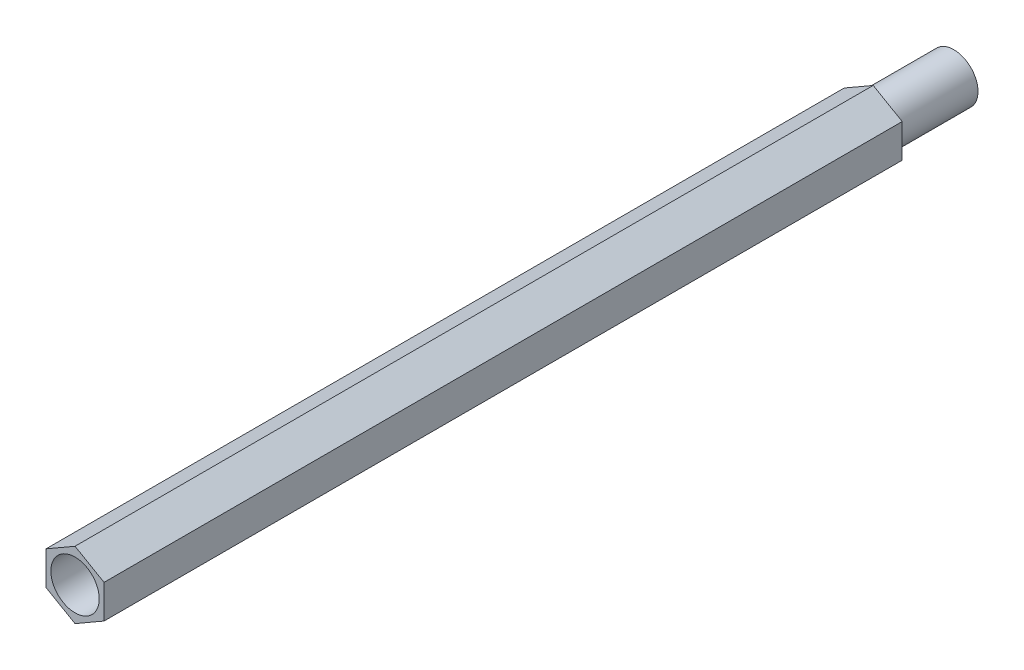
ISO-10303-21;
HEADER;
FILE_DESCRIPTION(('STEP AP214'),'2;1');
FILE_NAME('part.step','',(''),(''),'','','');
FILE_SCHEMA(('AUTOMOTIVE_DESIGN { 1 0 10303 214 1 1 1 1 }'));
ENDSEC;
DATA;
#1=APPLICATION_CONTEXT('core data for automotive mechanical design processes');
#2=APPLICATION_PROTOCOL_DEFINITION('international standard','automotive_design',2000,#1);
#3=PRODUCT_CONTEXT('',#1,'mechanical');
#4=PRODUCT('Part','Part','',(#3));
#5=PRODUCT_RELATED_PRODUCT_CATEGORY('part','',(#4));
#6=PRODUCT_DEFINITION_FORMATION('','',#4);
#7=PRODUCT_DEFINITION_CONTEXT('part definition',#1,'design');
#8=PRODUCT_DEFINITION('design','',#6,#7);
#9=PRODUCT_DEFINITION_SHAPE('','',#8);
#10=(LENGTH_UNIT() NAMED_UNIT(*) SI_UNIT(.MILLI.,.METRE.));
#11=(NAMED_UNIT(*) PLANE_ANGLE_UNIT() SI_UNIT($,.RADIAN.));
#12=(NAMED_UNIT(*) SI_UNIT($,.STERADIAN.) SOLID_ANGLE_UNIT());
#13=UNCERTAINTY_MEASURE_WITH_UNIT(LENGTH_MEASURE(1.E-05),#10,'distance_accuracy_value','');
#14=(GEOMETRIC_REPRESENTATION_CONTEXT(3) GLOBAL_UNCERTAINTY_ASSIGNED_CONTEXT((#13)) GLOBAL_UNIT_ASSIGNED_CONTEXT((#10,
#11,#12)) REPRESENTATION_CONTEXT('',''));
#15=CARTESIAN_POINT('',(0.,0.,0.));
#16=DIRECTION('',(0.,0.,1.));
#17=DIRECTION('',(1.,0.,0.));
#18=AXIS2_PLACEMENT_3D('',#15,#16,#17);
#19=CARTESIAN_POINT('',(0.,0.,49.5));
#20=DIRECTION('',(0.,0.,-1.));
#21=DIRECTION('',(-1.,0.,0.));
#22=AXIS2_PLACEMENT_3D('',#19,#20,#21);
#23=CYLINDRICAL_SURFACE('',#22,1.5);
#24=CARTESIAN_POINT('',(0.,0.,49.5));
#25=DIRECTION('',(0.,0.,1.));
#26=DIRECTION('',(1.,0.,0.));
#27=AXIS2_PLACEMENT_3D('',#24,#25,#26);
#28=CIRCLE('',#27,1.5);
#29=CARTESIAN_POINT('',(1.5,0.,49.5));
#30=VERTEX_POINT('',#29);
#31=EDGE_CURVE('E143',#30,#30,#28,.T.);
#32=ORIENTED_EDGE('',*,*,#31,.T.);
#33=EDGE_LOOP('',(#32));
#34=FACE_BOUND('',#33,.T.);
#35=CARTESIAN_POINT('',(0.,0.,5.));
#36=DIRECTION('',(0.,0.,-1.));
#37=DIRECTION('',(-1.,0.,0.));
#38=AXIS2_PLACEMENT_3D('',#35,#36,#37);
#39=CIRCLE('',#38,1.5);
#40=CARTESIAN_POINT('',(-1.5,0.,5.));
#41=VERTEX_POINT('',#40);
#42=EDGE_CURVE('E266',#41,#41,#39,.F.);
#43=ORIENTED_EDGE('',*,*,#42,.F.);
#44=EDGE_LOOP('',(#43));
#45=FACE_BOUND('',#44,.T.);
#46=ADVANCED_FACE('F47',(#34,#45),#23,.F.);
#47=CARTESIAN_POINT('',(0.,0.,49.5));
#48=DIRECTION('',(0.,0.,1.));
#49=DIRECTION('',(1.,0.,0.));
#50=AXIS2_PLACEMENT_3D('',#47,#48,#49);
#51=PLANE('',#50);
#52=DIRECTION('',(-0.866025403784439,0.5,0.));
#53=VECTOR('',#52,1.);
#54=CARTESIAN_POINT('',(1.8,1.03923048454133,49.5));
#55=LINE('',#54,#53);
#56=CARTESIAN_POINT('',(1.8,1.03923048454133,49.5));
#57=VERTEX_POINT('',#56);
#58=CARTESIAN_POINT('',(0.,2.07846096908265,49.5));
#59=VERTEX_POINT('',#58);
#60=EDGE_CURVE('E155',#57,#59,#55,.T.);
#61=ORIENTED_EDGE('',*,*,#60,.T.);
#62=DIRECTION('',(-0.866025403784439,-0.5,0.));
#63=VECTOR('',#62,1.);
#64=CARTESIAN_POINT('',(0.,2.07846096908265,49.5));
#65=LINE('',#64,#63);
#66=CARTESIAN_POINT('',(-1.8,1.03923048454133,49.5));
#67=VERTEX_POINT('',#66);
#68=EDGE_CURVE('E102',#59,#67,#65,.T.);
#69=ORIENTED_EDGE('',*,*,#68,.T.);
#70=DIRECTION('',(0.,-1.,0.));
#71=VECTOR('',#70,1.);
#72=CARTESIAN_POINT('',(-1.8,1.03923048454133,49.5));
#73=LINE('',#72,#71);
#74=CARTESIAN_POINT('',(-1.8,-1.03923048454133,49.5));
#75=VERTEX_POINT('',#74);
#76=EDGE_CURVE('E116',#67,#75,#73,.T.);
#77=ORIENTED_EDGE('',*,*,#76,.T.);
#78=DIRECTION('',(0.866025403784439,-0.5,0.));
#79=VECTOR('',#78,1.);
#80=CARTESIAN_POINT('',(-1.8,-1.03923048454133,49.5));
#81=LINE('',#80,#79);
#82=CARTESIAN_POINT('',(0.,-2.07846096908265,49.5));
#83=VERTEX_POINT('',#82);
#84=EDGE_CURVE('E109',#75,#83,#81,.T.);
#85=ORIENTED_EDGE('',*,*,#84,.T.);
#86=DIRECTION('',(0.866025403784439,0.5,0.));
#87=VECTOR('',#86,1.);
#88=CARTESIAN_POINT('',(0.,-2.07846096908265,49.5));
#89=LINE('',#88,#87);
#90=CARTESIAN_POINT('',(1.8,-1.03923048454133,49.5));
#91=VERTEX_POINT('',#90);
#92=EDGE_CURVE('E114',#83,#91,#89,.T.);
#93=ORIENTED_EDGE('',*,*,#92,.T.);
#94=DIRECTION('',(0.,1.,0.));
#95=VECTOR('',#94,1.);
#96=CARTESIAN_POINT('',(1.8,-1.03923048454133,49.5));
#97=LINE('',#96,#95);
#98=EDGE_CURVE('E65',#91,#57,#97,.T.);
#99=ORIENTED_EDGE('',*,*,#98,.T.);
#100=EDGE_LOOP('',(#61,#69,#77,#85,#93,#99));
#101=FACE_BOUND('',#100,.T.);
#102=ORIENTED_EDGE('',*,*,#31,.F.);
#103=EDGE_LOOP('',(#102));
#104=FACE_BOUND('',#103,.T.);
#105=ADVANCED_FACE('F111',(#101,#104),#51,.T.);
#106=CARTESIAN_POINT('',(0.,0.,0.));
#107=DIRECTION('',(0.,0.,1.));
#108=DIRECTION('',(1.,0.,0.));
#109=AXIS2_PLACEMENT_3D('',#106,#107,#108);
#110=PLANE('',#109);
#111=DIRECTION('',(-0.866025403784439,0.5,0.));
#112=VECTOR('',#111,1.);
#113=CARTESIAN_POINT('',(1.8,1.03923048454133,0.));
#114=LINE('',#113,#112);
#115=CARTESIAN_POINT('',(1.8,1.03923048454133,0.));
#116=VERTEX_POINT('',#115);
#117=CARTESIAN_POINT('',(0.,2.07846096908265,0.));
#118=VERTEX_POINT('',#117);
#119=EDGE_CURVE('E138',#116,#118,#114,.T.);
#120=ORIENTED_EDGE('',*,*,#119,.F.);
#121=DIRECTION('',(0.,1.,0.));
#122=VECTOR('',#121,1.);
#123=CARTESIAN_POINT('',(1.8,-1.03923048454133,0.));
#124=LINE('',#123,#122);
#125=CARTESIAN_POINT('',(1.8,-1.03923048454133,0.));
#126=VERTEX_POINT('',#125);
#127=EDGE_CURVE('E94',#126,#116,#124,.T.);
#128=ORIENTED_EDGE('',*,*,#127,.F.);
#129=DIRECTION('',(0.866025403784439,0.5,0.));
#130=VECTOR('',#129,1.);
#131=CARTESIAN_POINT('',(0.,-2.07846096908265,0.));
#132=LINE('',#131,#130);
#133=CARTESIAN_POINT('',(0.,-2.07846096908265,0.));
#134=VERTEX_POINT('',#133);
#135=EDGE_CURVE('E88',#134,#126,#132,.T.);
#136=ORIENTED_EDGE('',*,*,#135,.F.);
#137=DIRECTION('',(0.866025403784439,-0.5,0.));
#138=VECTOR('',#137,1.);
#139=CARTESIAN_POINT('',(-1.8,-1.03923048454133,0.));
#140=LINE('',#139,#138);
#141=CARTESIAN_POINT('',(-1.8,-1.03923048454133,0.));
#142=VERTEX_POINT('',#141);
#143=EDGE_CURVE('E125',#142,#134,#140,.T.);
#144=ORIENTED_EDGE('',*,*,#143,.F.);
#145=DIRECTION('',(0.,-1.,0.));
#146=VECTOR('',#145,1.);
#147=CARTESIAN_POINT('',(-1.8,1.03923048454133,0.));
#148=LINE('',#147,#146);
#149=CARTESIAN_POINT('',(-1.8,1.03923048454133,0.));
#150=VERTEX_POINT('',#149);
#151=EDGE_CURVE('E146',#150,#142,#148,.T.);
#152=ORIENTED_EDGE('',*,*,#151,.F.);
#153=DIRECTION('',(-0.866025403784439,-0.5,0.));
#154=VECTOR('',#153,1.);
#155=CARTESIAN_POINT('',(0.,2.07846096908265,0.));
#156=LINE('',#155,#154);
#157=EDGE_CURVE('E142',#118,#150,#156,.T.);
#158=ORIENTED_EDGE('',*,*,#157,.F.);
#159=EDGE_LOOP('',(#120,#128,#136,#144,#152,#158));
#160=FACE_BOUND('',#159,.T.);
#161=CARTESIAN_POINT('',(0.,0.,0.));
#162=DIRECTION('',(0.,0.,1.));
#163=DIRECTION('',(1.,0.,0.));
#164=AXIS2_PLACEMENT_3D('',#161,#162,#163);
#165=CIRCLE('',#164,1.5);
#166=CARTESIAN_POINT('',(1.5,0.,0.));
#167=VERTEX_POINT('',#166);
#168=EDGE_CURVE('E265',#167,#167,#165,.T.);
#169=ORIENTED_EDGE('',*,*,#168,.T.);
#170=EDGE_LOOP('',(#169));
#171=FACE_BOUND('',#170,.T.);
#172=ADVANCED_FACE('F168',(#160,#171),#110,.F.);
#173=CARTESIAN_POINT('',(1.8,1.03923048454133,49.5));
#174=DIRECTION('',(-0.5,-0.866025403784439,0.));
#175=DIRECTION('',(0.866025403784439,-0.5,0.));
#176=AXIS2_PLACEMENT_3D('',#173,#174,#175);
#177=PLANE('',#176);
#178=ORIENTED_EDGE('',*,*,#119,.T.);
#179=DIRECTION('',(0.,0.,-1.));
#180=VECTOR('',#179,1.);
#181=CARTESIAN_POINT('',(0.,2.07846096908265,49.5));
#182=LINE('',#181,#180);
#183=EDGE_CURVE('E11',#59,#118,#182,.T.);
#184=ORIENTED_EDGE('',*,*,#183,.F.);
#185=ORIENTED_EDGE('',*,*,#60,.F.);
#186=DIRECTION('',(0.,0.,-1.));
#187=VECTOR('',#186,1.);
#188=CARTESIAN_POINT('',(1.8,1.03923048454133,49.5));
#189=LINE('',#188,#187);
#190=EDGE_CURVE('E134',#57,#116,#189,.T.);
#191=ORIENTED_EDGE('',*,*,#190,.T.);
#192=EDGE_LOOP('',(#178,#184,#185,#191));
#193=FACE_BOUND('',#192,.T.);
#194=ADVANCED_FACE('F49',(#193),#177,.F.);
#195=CARTESIAN_POINT('',(0.,2.07846096908265,49.5));
#196=DIRECTION('',(0.5,-0.866025403784438,0.));
#197=DIRECTION('',(0.866025403784439,0.5,0.));
#198=AXIS2_PLACEMENT_3D('',#195,#196,#197);
#199=PLANE('',#198);
#200=ORIENTED_EDGE('',*,*,#157,.T.);
#201=DIRECTION('',(0.,0.,-1.));
#202=VECTOR('',#201,1.);
#203=CARTESIAN_POINT('',(-1.8,1.03923048454133,49.5));
#204=LINE('',#203,#202);
#205=EDGE_CURVE('E57',#67,#150,#204,.T.);
#206=ORIENTED_EDGE('',*,*,#205,.F.);
#207=ORIENTED_EDGE('',*,*,#68,.F.);
#208=ORIENTED_EDGE('',*,*,#183,.T.);
#209=EDGE_LOOP('',(#200,#206,#207,#208));
#210=FACE_BOUND('',#209,.T.);
#211=ADVANCED_FACE('F200',(#210),#199,.F.);
#212=CARTESIAN_POINT('',(-1.8,1.03923048454133,49.5));
#213=DIRECTION('',(1.,0.,0.));
#214=DIRECTION('',(0.,1.,0.));
#215=AXIS2_PLACEMENT_3D('',#212,#213,#214);
#216=PLANE('',#215);
#217=ORIENTED_EDGE('',*,*,#151,.T.);
#218=DIRECTION('',(0.,0.,-1.));
#219=VECTOR('',#218,1.);
#220=CARTESIAN_POINT('',(-1.8,-1.03923048454133,49.5));
#221=LINE('',#220,#219);
#222=EDGE_CURVE('E127',#75,#142,#221,.T.);
#223=ORIENTED_EDGE('',*,*,#222,.F.);
#224=ORIENTED_EDGE('',*,*,#76,.F.);
#225=ORIENTED_EDGE('',*,*,#205,.T.);
#226=EDGE_LOOP('',(#217,#223,#224,#225));
#227=FACE_BOUND('',#226,.T.);
#228=ADVANCED_FACE('F165',(#227),#216,.F.);
#229=CARTESIAN_POINT('',(-1.8,-1.03923048454133,49.5));
#230=DIRECTION('',(0.5,0.866025403784439,0.));
#231=DIRECTION('',(-0.866025403784439,0.5,0.));
#232=AXIS2_PLACEMENT_3D('',#229,#230,#231);
#233=PLANE('',#232);
#234=ORIENTED_EDGE('',*,*,#143,.T.);
#235=DIRECTION('',(0.,0.,-1.));
#236=VECTOR('',#235,1.);
#237=CARTESIAN_POINT('',(0.,-2.07846096908265,49.5));
#238=LINE('',#237,#236);
#239=EDGE_CURVE('E122',#83,#134,#238,.T.);
#240=ORIENTED_EDGE('',*,*,#239,.F.);
#241=ORIENTED_EDGE('',*,*,#84,.F.);
#242=ORIENTED_EDGE('',*,*,#222,.T.);
#243=EDGE_LOOP('',(#234,#240,#241,#242));
#244=FACE_BOUND('',#243,.T.);
#245=ADVANCED_FACE('F123',(#244),#233,.F.);
#246=CARTESIAN_POINT('',(0.,-2.07846096908265,49.5));
#247=DIRECTION('',(-0.5,0.866025403784439,0.));
#248=DIRECTION('',(-0.866025403784439,-0.5,0.));
#249=AXIS2_PLACEMENT_3D('',#246,#247,#248);
#250=PLANE('',#249);
#251=ORIENTED_EDGE('',*,*,#135,.T.);
#252=DIRECTION('',(0.,0.,-1.));
#253=VECTOR('',#252,1.);
#254=CARTESIAN_POINT('',(1.8,-1.03923048454133,49.5));
#255=LINE('',#254,#253);
#256=EDGE_CURVE('E128',#91,#126,#255,.T.);
#257=ORIENTED_EDGE('',*,*,#256,.F.);
#258=ORIENTED_EDGE('',*,*,#92,.F.);
#259=ORIENTED_EDGE('',*,*,#239,.T.);
#260=EDGE_LOOP('',(#251,#257,#258,#259));
#261=FACE_BOUND('',#260,.T.);
#262=ADVANCED_FACE('F130',(#261),#250,.F.);
#263=CARTESIAN_POINT('',(1.8,-1.03923048454133,49.5));
#264=DIRECTION('',(-1.,0.,0.));
#265=DIRECTION('',(0.,-1.,0.));
#266=AXIS2_PLACEMENT_3D('',#263,#264,#265);
#267=PLANE('',#266);
#268=ORIENTED_EDGE('',*,*,#127,.T.);
#269=ORIENTED_EDGE('',*,*,#190,.F.);
#270=ORIENTED_EDGE('',*,*,#98,.F.);
#271=ORIENTED_EDGE('',*,*,#256,.T.);
#272=EDGE_LOOP('',(#268,#269,#270,#271));
#273=FACE_BOUND('',#272,.T.);
#274=ADVANCED_FACE('F173',(#273),#267,.F.);
#275=CARTESIAN_POINT('',(0.,0.,5.));
#276=DIRECTION('',(0.,0.,-1.));
#277=DIRECTION('',(-1.,0.,0.));
#278=AXIS2_PLACEMENT_3D('',#275,#276,#277);
#279=PLANE('',#278);
#280=ORIENTED_EDGE('',*,*,#42,.T.);
#281=EDGE_LOOP('',(#280));
#282=FACE_BOUND('',#281,.T.);
#283=ADVANCED_FACE('F175',(#282),#279,.F.);
#284=CARTESIAN_POINT('',(0.,0.,-5.));
#285=DIRECTION('',(0.,0.,1.));
#286=DIRECTION('',(1.,0.,0.));
#287=AXIS2_PLACEMENT_3D('',#284,#285,#286);
#288=CYLINDRICAL_SURFACE('',#287,1.5);
#289=CARTESIAN_POINT('',(0.,0.,-5.));
#290=DIRECTION('',(0.,0.,-1.));
#291=DIRECTION('',(-1.,0.,0.));
#292=AXIS2_PLACEMENT_3D('',#289,#290,#291);
#293=CIRCLE('',#292,1.5);
#294=CARTESIAN_POINT('',(-1.5,0.,-5.));
#295=VERTEX_POINT('',#294);
#296=EDGE_CURVE('E263',#295,#295,#293,.F.);
#297=ORIENTED_EDGE('',*,*,#296,.T.);
#298=EDGE_LOOP('',(#297));
#299=FACE_BOUND('',#298,.T.);
#300=ORIENTED_EDGE('',*,*,#168,.F.);
#301=EDGE_LOOP('',(#300));
#302=FACE_BOUND('',#301,.T.);
#303=ADVANCED_FACE('F182',(#299,#302),#288,.T.);
#304=CARTESIAN_POINT('',(0.,0.,-5.));
#305=DIRECTION('',(0.,0.,-1.));
#306=DIRECTION('',(-1.,0.,0.));
#307=AXIS2_PLACEMENT_3D('',#304,#305,#306);
#308=PLANE('',#307);
#309=ORIENTED_EDGE('',*,*,#296,.F.);
#310=EDGE_LOOP('',(#309));
#311=FACE_BOUND('',#310,.T.);
#312=ADVANCED_FACE('F243',(#311),#308,.T.);
#313=CLOSED_SHELL('',(#46,#105,#172,#194,#211,#228,#245,#262,#274,#283,#303,#312));
#314=MANIFOLD_SOLID_BREP('B2',#313);
#315=ADVANCED_BREP_SHAPE_REPRESENTATION('',(#18,#314),#14);
#316=SHAPE_DEFINITION_REPRESENTATION(#9,#315);
ENDSEC;
END-ISO-10303-21;
